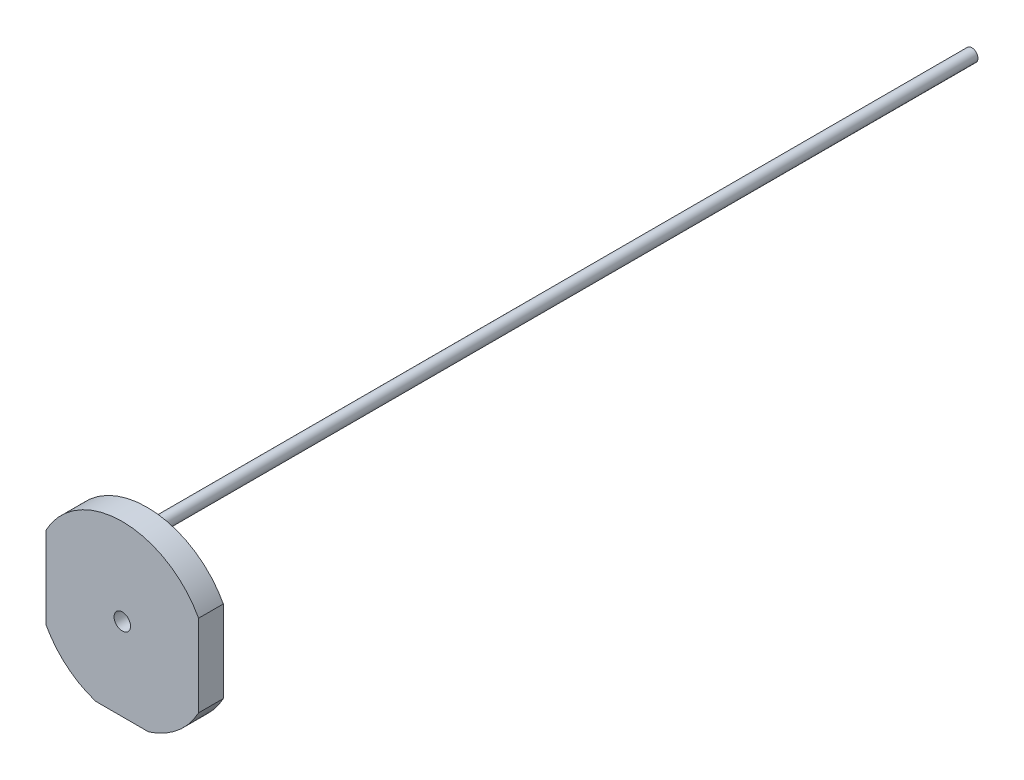
ISO-10303-21;
HEADER;
FILE_DESCRIPTION(('STEP AP214'),'2;1');
FILE_NAME('part.step','',(''),(''),'','','');
FILE_SCHEMA(('AUTOMOTIVE_DESIGN { 1 0 10303 214 1 1 1 1 }'));
ENDSEC;
DATA;
#1=APPLICATION_CONTEXT('core data for automotive mechanical design processes');
#2=APPLICATION_PROTOCOL_DEFINITION('international standard','automotive_design',2000,#1);
#3=PRODUCT_CONTEXT('',#1,'mechanical');
#4=PRODUCT('Part','Part','',(#3));
#5=PRODUCT_RELATED_PRODUCT_CATEGORY('part','',(#4));
#6=PRODUCT_DEFINITION_FORMATION('','',#4);
#7=PRODUCT_DEFINITION_CONTEXT('part definition',#1,'design');
#8=PRODUCT_DEFINITION('design','',#6,#7);
#9=PRODUCT_DEFINITION_SHAPE('','',#8);
#10=(LENGTH_UNIT() NAMED_UNIT(*) SI_UNIT(.MILLI.,.METRE.));
#11=(NAMED_UNIT(*) PLANE_ANGLE_UNIT() SI_UNIT($,.RADIAN.));
#12=(NAMED_UNIT(*) SI_UNIT($,.STERADIAN.) SOLID_ANGLE_UNIT());
#13=UNCERTAINTY_MEASURE_WITH_UNIT(LENGTH_MEASURE(1.E-05),#10,'distance_accuracy_value','');
#14=(GEOMETRIC_REPRESENTATION_CONTEXT(3) GLOBAL_UNCERTAINTY_ASSIGNED_CONTEXT((#13)) GLOBAL_UNIT_ASSIGNED_CONTEXT((#10,
#11,#12)) REPRESENTATION_CONTEXT('',''));
#15=CARTESIAN_POINT('',(0.,0.,0.));
#16=DIRECTION('',(0.,0.,1.));
#17=DIRECTION('',(1.,0.,0.));
#18=AXIS2_PLACEMENT_3D('',#15,#16,#17);
#19=CARTESIAN_POINT('',(0.,0.,-6.));
#20=DIRECTION('',(0.,0.,1.));
#21=DIRECTION('',(1.,0.,0.));
#22=AXIS2_PLACEMENT_3D('',#19,#20,#21);
#23=CYLINDRICAL_SURFACE('',#22,21.);
#24=CARTESIAN_POINT('',(0.,0.,0.));
#25=DIRECTION('',(0.,0.,1.));
#26=DIRECTION('',(1.,0.,0.));
#27=AXIS2_PLACEMENT_3D('',#24,#25,#26);
#28=CIRCLE('',#27,21.);
#29=CARTESIAN_POINT('',(-18.5,-9.9373034571759,0.));
#30=VERTEX_POINT('',#29);
#31=CARTESIAN_POINT('',(-6.40312423743284,-20.,0.));
#32=VERTEX_POINT('',#31);
#33=EDGE_CURVE('E136',#30,#32,#28,.T.);
#34=ORIENTED_EDGE('',*,*,#33,.F.);
#35=DIRECTION('',(0.,0.,1.));
#36=VECTOR('',#35,1.);
#37=CARTESIAN_POINT('',(-18.5,-9.9373034571759,-6.));
#38=LINE('',#37,#36);
#39=CARTESIAN_POINT('',(-18.5,-9.9373034571759,-6.));
#40=VERTEX_POINT('',#39);
#41=EDGE_CURVE('E11',#40,#30,#38,.T.);
#42=ORIENTED_EDGE('',*,*,#41,.F.);
#43=CARTESIAN_POINT('',(0.,0.,-6.));
#44=DIRECTION('',(0.,0.,1.));
#45=DIRECTION('',(1.,0.,0.));
#46=AXIS2_PLACEMENT_3D('',#43,#44,#45);
#47=CIRCLE('',#46,21.);
#48=CARTESIAN_POINT('',(-6.40312423743284,-20.,-6.));
#49=VERTEX_POINT('',#48);
#50=EDGE_CURVE('E157',#40,#49,#47,.T.);
#51=ORIENTED_EDGE('',*,*,#50,.T.);
#52=DIRECTION('',(0.,0.,1.));
#53=VECTOR('',#52,1.);
#54=CARTESIAN_POINT('',(-6.40312423743284,-20.,-6.));
#55=LINE('',#54,#53);
#56=EDGE_CURVE('E48',#49,#32,#55,.T.);
#57=ORIENTED_EDGE('',*,*,#56,.T.);
#58=EDGE_LOOP('',(#34,#42,#51,#57));
#59=FACE_BOUND('',#58,.T.);
#60=ADVANCED_FACE('F45',(#59),#23,.T.);
#61=CARTESIAN_POINT('',(-18.5,9.9373034571759,-6.));
#62=DIRECTION('',(-1.,0.,0.));
#63=DIRECTION('',(0.,0.,1.));
#64=AXIS2_PLACEMENT_3D('',#61,#62,#63);
#65=PLANE('',#64);
#66=DIRECTION('',(0.,-1.,0.));
#67=VECTOR('',#66,1.);
#68=CARTESIAN_POINT('',(-18.5,9.9373034571759,0.));
#69=LINE('',#68,#67);
#70=CARTESIAN_POINT('',(-18.5,9.9373034571759,0.));
#71=VERTEX_POINT('',#70);
#72=EDGE_CURVE('E154',#71,#30,#69,.T.);
#73=ORIENTED_EDGE('',*,*,#72,.F.);
#74=DIRECTION('',(0.,0.,1.));
#75=VECTOR('',#74,1.);
#76=CARTESIAN_POINT('',(-18.5,9.9373034571759,-6.));
#77=LINE('',#76,#75);
#78=CARTESIAN_POINT('',(-18.5,9.9373034571759,-6.));
#79=VERTEX_POINT('',#78);
#80=EDGE_CURVE('E55',#79,#71,#77,.T.);
#81=ORIENTED_EDGE('',*,*,#80,.F.);
#82=DIRECTION('',(0.,-1.,0.));
#83=VECTOR('',#82,1.);
#84=CARTESIAN_POINT('',(-18.5,9.9373034571759,-6.));
#85=LINE('',#84,#83);
#86=EDGE_CURVE('E122',#79,#40,#85,.T.);
#87=ORIENTED_EDGE('',*,*,#86,.T.);
#88=ORIENTED_EDGE('',*,*,#41,.T.);
#89=EDGE_LOOP('',(#73,#81,#87,#88));
#90=FACE_BOUND('',#89,.T.);
#91=ADVANCED_FACE('F169',(#90),#65,.T.);
#92=CARTESIAN_POINT('',(0.,0.,-6.));
#93=DIRECTION('',(0.,0.,1.));
#94=DIRECTION('',(1.,0.,0.));
#95=AXIS2_PLACEMENT_3D('',#92,#93,#94);
#96=CYLINDRICAL_SURFACE('',#95,21.);
#97=CARTESIAN_POINT('',(0.,0.,0.));
#98=DIRECTION('',(0.,0.,1.));
#99=DIRECTION('',(1.,0.,0.));
#100=AXIS2_PLACEMENT_3D('',#97,#98,#99);
#101=CIRCLE('',#100,21.);
#102=CARTESIAN_POINT('',(18.5,9.9373034571759,0.));
#103=VERTEX_POINT('',#102);
#104=EDGE_CURVE('E108',#103,#71,#101,.T.);
#105=ORIENTED_EDGE('',*,*,#104,.F.);
#106=DIRECTION('',(0.,0.,1.));
#107=VECTOR('',#106,1.);
#108=CARTESIAN_POINT('',(18.5,9.9373034571759,-6.));
#109=LINE('',#108,#107);
#110=CARTESIAN_POINT('',(18.5,9.9373034571759,-6.));
#111=VERTEX_POINT('',#110);
#112=EDGE_CURVE('E103',#111,#103,#109,.T.);
#113=ORIENTED_EDGE('',*,*,#112,.F.);
#114=CARTESIAN_POINT('',(0.,0.,-6.));
#115=DIRECTION('',(0.,0.,1.));
#116=DIRECTION('',(1.,0.,0.));
#117=AXIS2_PLACEMENT_3D('',#114,#115,#116);
#118=CIRCLE('',#117,21.);
#119=EDGE_CURVE('E106',#111,#79,#118,.T.);
#120=ORIENTED_EDGE('',*,*,#119,.T.);
#121=ORIENTED_EDGE('',*,*,#80,.T.);
#122=EDGE_LOOP('',(#105,#113,#120,#121));
#123=FACE_BOUND('',#122,.T.);
#124=ADVANCED_FACE('F105',(#123),#96,.T.);
#125=CARTESIAN_POINT('',(18.5,9.9373034571759,-6.));
#126=DIRECTION('',(1.,0.,0.));
#127=DIRECTION('',(0.,0.,-1.));
#128=AXIS2_PLACEMENT_3D('',#125,#126,#127);
#129=PLANE('',#128);
#130=DIRECTION('',(0.,1.,0.));
#131=VECTOR('',#130,1.);
#132=CARTESIAN_POINT('',(18.5,9.9373034571759,0.));
#133=LINE('',#132,#131);
#134=CARTESIAN_POINT('',(18.5,-9.9373034571759,0.));
#135=VERTEX_POINT('',#134);
#136=EDGE_CURVE('E149',#135,#103,#133,.T.);
#137=ORIENTED_EDGE('',*,*,#136,.F.);
#138=DIRECTION('',(0.,0.,1.));
#139=VECTOR('',#138,1.);
#140=CARTESIAN_POINT('',(18.5,-9.9373034571759,-6.));
#141=LINE('',#140,#139);
#142=CARTESIAN_POINT('',(18.5,-9.9373034571759,-6.));
#143=VERTEX_POINT('',#142);
#144=EDGE_CURVE('E114',#143,#135,#141,.T.);
#145=ORIENTED_EDGE('',*,*,#144,.F.);
#146=DIRECTION('',(0.,1.,0.));
#147=VECTOR('',#146,1.);
#148=CARTESIAN_POINT('',(18.5,9.9373034571759,-6.));
#149=LINE('',#148,#147);
#150=EDGE_CURVE('E120',#143,#111,#149,.T.);
#151=ORIENTED_EDGE('',*,*,#150,.T.);
#152=ORIENTED_EDGE('',*,*,#112,.T.);
#153=EDGE_LOOP('',(#137,#145,#151,#152));
#154=FACE_BOUND('',#153,.T.);
#155=ADVANCED_FACE('F125',(#154),#129,.T.);
#156=CARTESIAN_POINT('',(0.,0.,-6.));
#157=DIRECTION('',(0.,0.,1.));
#158=DIRECTION('',(1.,0.,0.));
#159=AXIS2_PLACEMENT_3D('',#156,#157,#158);
#160=CYLINDRICAL_SURFACE('',#159,21.);
#161=CARTESIAN_POINT('',(0.,0.,0.));
#162=DIRECTION('',(0.,0.,1.));
#163=DIRECTION('',(1.,0.,0.));
#164=AXIS2_PLACEMENT_3D('',#161,#162,#163);
#165=CIRCLE('',#164,21.);
#166=CARTESIAN_POINT('',(6.40312423743286,-20.,0.));
#167=VERTEX_POINT('',#166);
#168=EDGE_CURVE('E145',#167,#135,#165,.T.);
#169=ORIENTED_EDGE('',*,*,#168,.F.);
#170=DIRECTION('',(0.,0.,1.));
#171=VECTOR('',#170,1.);
#172=CARTESIAN_POINT('',(6.40312423743286,-20.,-6.));
#173=LINE('',#172,#171);
#174=CARTESIAN_POINT('',(6.40312423743286,-20.,-6.));
#175=VERTEX_POINT('',#174);
#176=EDGE_CURVE('E162',#175,#167,#173,.T.);
#177=ORIENTED_EDGE('',*,*,#176,.F.);
#178=CARTESIAN_POINT('',(0.,0.,-6.));
#179=DIRECTION('',(0.,0.,1.));
#180=DIRECTION('',(1.,0.,0.));
#181=AXIS2_PLACEMENT_3D('',#178,#179,#180);
#182=CIRCLE('',#181,21.);
#183=EDGE_CURVE('E127',#175,#143,#182,.T.);
#184=ORIENTED_EDGE('',*,*,#183,.T.);
#185=ORIENTED_EDGE('',*,*,#144,.T.);
#186=EDGE_LOOP('',(#169,#177,#184,#185));
#187=FACE_BOUND('',#186,.T.);
#188=ADVANCED_FACE('F182',(#187),#160,.T.);
#189=CARTESIAN_POINT('',(-6.40312423743284,-20.,-6.));
#190=DIRECTION('',(0.,-1.,0.));
#191=DIRECTION('',(1.,0.,0.));
#192=AXIS2_PLACEMENT_3D('',#189,#190,#191);
#193=PLANE('',#192);
#194=DIRECTION('',(1.,0.,0.));
#195=VECTOR('',#194,1.);
#196=CARTESIAN_POINT('',(-6.40312423743284,-20.,0.));
#197=LINE('',#196,#195);
#198=EDGE_CURVE('E140',#32,#167,#197,.T.);
#199=ORIENTED_EDGE('',*,*,#198,.F.);
#200=ORIENTED_EDGE('',*,*,#56,.F.);
#201=DIRECTION('',(1.,0.,0.));
#202=VECTOR('',#201,1.);
#203=CARTESIAN_POINT('',(-6.40312423743284,-20.,-6.));
#204=LINE('',#203,#202);
#205=EDGE_CURVE('E130',#49,#175,#204,.T.);
#206=ORIENTED_EDGE('',*,*,#205,.T.);
#207=ORIENTED_EDGE('',*,*,#176,.T.);
#208=EDGE_LOOP('',(#199,#200,#206,#207));
#209=FACE_BOUND('',#208,.T.);
#210=ADVANCED_FACE('F166',(#209),#193,.T.);
#211=CARTESIAN_POINT('',(0.,0.,-6.));
#212=DIRECTION('',(0.,0.,1.));
#213=DIRECTION('',(1.,0.,0.));
#214=AXIS2_PLACEMENT_3D('',#211,#212,#213);
#215=PLANE('',#214);
#216=CARTESIAN_POINT('',(0.,16.,-6.00000000000001));
#217=DIRECTION('',(0.,0.,1.));
#218=DIRECTION('',(1.,0.,0.));
#219=AXIS2_PLACEMENT_3D('',#216,#217,#218);
#220=CIRCLE('',#219,1.5);
#221=CARTESIAN_POINT('',(1.5,16.,-6.00000000000001));
#222=VERTEX_POINT('',#221);
#223=EDGE_CURVE('E214',#222,#222,#220,.T.);
#224=ORIENTED_EDGE('',*,*,#223,.T.);
#225=EDGE_LOOP('',(#224));
#226=FACE_BOUND('',#225,.T.);
#227=CARTESIAN_POINT('',(0.,0.,-6.));
#228=DIRECTION('',(0.,0.,1.));
#229=DIRECTION('',(1.,0.,0.));
#230=AXIS2_PLACEMENT_3D('',#227,#228,#229);
#231=CIRCLE('',#230,2.);
#232=CARTESIAN_POINT('',(2.,0.,-6.));
#233=VERTEX_POINT('',#232);
#234=EDGE_CURVE('E141',#233,#233,#231,.T.);
#235=ORIENTED_EDGE('',*,*,#234,.T.);
#236=EDGE_LOOP('',(#235));
#237=FACE_BOUND('',#236,.T.);
#238=ORIENTED_EDGE('',*,*,#50,.F.);
#239=ORIENTED_EDGE('',*,*,#86,.F.);
#240=ORIENTED_EDGE('',*,*,#119,.F.);
#241=ORIENTED_EDGE('',*,*,#150,.F.);
#242=ORIENTED_EDGE('',*,*,#183,.F.);
#243=ORIENTED_EDGE('',*,*,#205,.F.);
#244=EDGE_LOOP('',(#238,#239,#240,#241,#242,#243));
#245=FACE_BOUND('',#244,.T.);
#246=ADVANCED_FACE('F118',(#226,#237,#245),#215,.F.);
#247=CARTESIAN_POINT('',(0.,0.,0.));
#248=DIRECTION('',(0.,0.,1.));
#249=DIRECTION('',(1.,0.,0.));
#250=AXIS2_PLACEMENT_3D('',#247,#248,#249);
#251=PLANE('',#250);
#252=CARTESIAN_POINT('',(0.,0.,0.));
#253=DIRECTION('',(0.,0.,1.));
#254=DIRECTION('',(1.,0.,0.));
#255=AXIS2_PLACEMENT_3D('',#252,#253,#254);
#256=CIRCLE('',#255,2.);
#257=CARTESIAN_POINT('',(2.,0.,0.));
#258=VERTEX_POINT('',#257);
#259=EDGE_CURVE('E217',#258,#258,#256,.T.);
#260=ORIENTED_EDGE('',*,*,#259,.F.);
#261=EDGE_LOOP('',(#260));
#262=FACE_BOUND('',#261,.T.);
#263=ORIENTED_EDGE('',*,*,#33,.T.);
#264=ORIENTED_EDGE('',*,*,#198,.T.);
#265=ORIENTED_EDGE('',*,*,#168,.T.);
#266=ORIENTED_EDGE('',*,*,#136,.T.);
#267=ORIENTED_EDGE('',*,*,#104,.T.);
#268=ORIENTED_EDGE('',*,*,#72,.T.);
#269=EDGE_LOOP('',(#263,#264,#265,#266,#267,#268));
#270=FACE_BOUND('',#269,.T.);
#271=ADVANCED_FACE('F168',(#262,#270),#251,.T.);
#272=CARTESIAN_POINT('',(0.,0.,-6.));
#273=DIRECTION('',(0.,0.,1.));
#274=DIRECTION('',(1.,0.,0.));
#275=AXIS2_PLACEMENT_3D('',#272,#273,#274);
#276=CYLINDRICAL_SURFACE('',#275,2.);
#277=ORIENTED_EDGE('',*,*,#234,.F.);
#278=EDGE_LOOP('',(#277));
#279=FACE_BOUND('',#278,.T.);
#280=ORIENTED_EDGE('',*,*,#259,.T.);
#281=EDGE_LOOP('',(#280));
#282=FACE_BOUND('',#281,.T.);
#283=ADVANCED_FACE('F194',(#279,#282),#276,.F.);
#284=CARTESIAN_POINT('',(0.,16.,-206.));
#285=DIRECTION('',(0.,0.,1.));
#286=DIRECTION('',(1.,0.,0.));
#287=AXIS2_PLACEMENT_3D('',#284,#285,#286);
#288=CYLINDRICAL_SURFACE('',#287,1.5);
#289=CARTESIAN_POINT('',(0.,16.,-206.));
#290=DIRECTION('',(0.,0.,1.));
#291=DIRECTION('',(1.,0.,0.));
#292=AXIS2_PLACEMENT_3D('',#289,#290,#291);
#293=CIRCLE('',#292,1.5);
#294=CARTESIAN_POINT('',(1.5,16.,-206.));
#295=VERTEX_POINT('',#294);
#296=EDGE_CURVE('E212',#295,#295,#293,.T.);
#297=ORIENTED_EDGE('',*,*,#296,.T.);
#298=EDGE_LOOP('',(#297));
#299=FACE_BOUND('',#298,.T.);
#300=ORIENTED_EDGE('',*,*,#223,.F.);
#301=EDGE_LOOP('',(#300));
#302=FACE_BOUND('',#301,.T.);
#303=ADVANCED_FACE('F200',(#299,#302),#288,.T.);
#304=CARTESIAN_POINT('',(0.,16.,-206.));
#305=DIRECTION('',(0.,0.,1.));
#306=DIRECTION('',(1.,0.,0.));
#307=AXIS2_PLACEMENT_3D('',#304,#305,#306);
#308=PLANE('',#307);
#309=ORIENTED_EDGE('',*,*,#296,.F.);
#310=EDGE_LOOP('',(#309));
#311=FACE_BOUND('',#310,.T.);
#312=ADVANCED_FACE('F204',(#311),#308,.F.);
#313=CLOSED_SHELL('',(#60,#91,#124,#155,#188,#210,#246,#271,#283,#303,#312));
#314=MANIFOLD_SOLID_BREP('B2',#313);
#315=ADVANCED_BREP_SHAPE_REPRESENTATION('',(#18,#314),#14);
#316=SHAPE_DEFINITION_REPRESENTATION(#9,#315);
ENDSEC;
END-ISO-10303-21;
